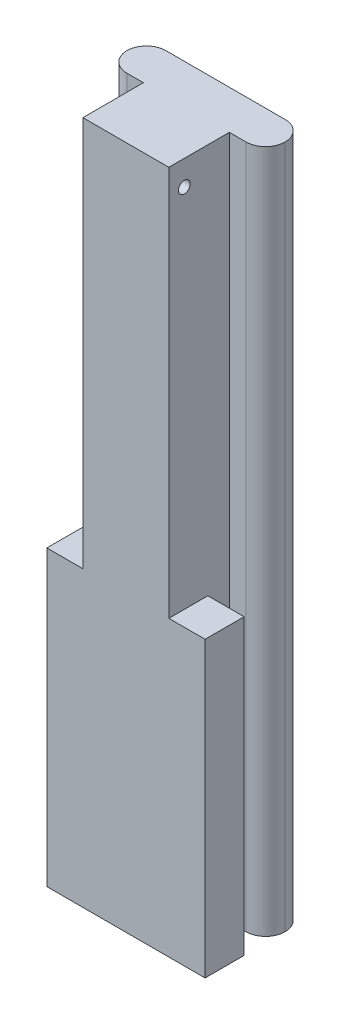
ISO-10303-21;
HEADER;
FILE_DESCRIPTION(('STEP AP214'),'2;1');
FILE_NAME('part.step','',(''),(''),'','','');
FILE_SCHEMA(('AUTOMOTIVE_DESIGN { 1 0 10303 214 1 1 1 1 }'));
ENDSEC;
DATA;
#1=APPLICATION_CONTEXT('core data for automotive mechanical design processes');
#2=APPLICATION_PROTOCOL_DEFINITION('international standard','automotive_design',2000,#1);
#3=PRODUCT_CONTEXT('',#1,'mechanical');
#4=PRODUCT('Part','Part','',(#3));
#5=PRODUCT_RELATED_PRODUCT_CATEGORY('part','',(#4));
#6=PRODUCT_DEFINITION_FORMATION('','',#4);
#7=PRODUCT_DEFINITION_CONTEXT('part definition',#1,'design');
#8=PRODUCT_DEFINITION('design','',#6,#7);
#9=PRODUCT_DEFINITION_SHAPE('','',#8);
#10=(LENGTH_UNIT() NAMED_UNIT(*) SI_UNIT(.MILLI.,.METRE.));
#11=(NAMED_UNIT(*) PLANE_ANGLE_UNIT() SI_UNIT($,.RADIAN.));
#12=(NAMED_UNIT(*) SI_UNIT($,.STERADIAN.) SOLID_ANGLE_UNIT());
#13=UNCERTAINTY_MEASURE_WITH_UNIT(LENGTH_MEASURE(1.E-05),#10,'distance_accuracy_value','');
#14=(GEOMETRIC_REPRESENTATION_CONTEXT(3) GLOBAL_UNCERTAINTY_ASSIGNED_CONTEXT((#13)) GLOBAL_UNIT_ASSIGNED_CONTEXT((#10,
#11,#12)) REPRESENTATION_CONTEXT('',''));
#15=CARTESIAN_POINT('',(0.,0.,0.));
#16=DIRECTION('',(0.,0.,1.));
#17=DIRECTION('',(1.,0.,0.));
#18=AXIS2_PLACEMENT_3D('',#15,#16,#17);
#19=CARTESIAN_POINT('',(205.763637230943,889.508,0.));
#20=DIRECTION('',(1.,0.,0.));
#21=DIRECTION('',(0.,0.,-1.));
#22=AXIS2_PLACEMENT_3D('',#19,#20,#21);
#23=PLANE('',#22);
#24=DIRECTION('',(0.,-1.,0.));
#25=VECTOR('',#24,1.);
#26=CARTESIAN_POINT('',(205.763637230943,889.508,78.6954653433618));
#27=LINE('',#26,#25);
#28=CARTESIAN_POINT('',(205.763637230943,381.508,78.6954653433618));
#29=VERTEX_POINT('',#28);
#30=CARTESIAN_POINT('',(205.763637230943,0.,78.6954653433618));
#31=VERTEX_POINT('',#30);
#32=EDGE_CURVE('E182',#29,#31,#27,.T.);
#33=ORIENTED_EDGE('',*,*,#32,.F.);
#34=DIRECTION('',(0.,0.,-1.));
#35=VECTOR('',#34,1.);
#36=CARTESIAN_POINT('',(205.763637230943,381.508,129.455055737705));
#37=LINE('',#36,#35);
#38=CARTESIAN_POINT('',(205.763637230943,381.508,129.455055737705));
#39=VERTEX_POINT('',#38);
#40=EDGE_CURVE('E171',#39,#29,#37,.T.);
#41=ORIENTED_EDGE('',*,*,#40,.F.);
#42=DIRECTION('',(0.,-1.,0.));
#43=VECTOR('',#42,1.);
#44=CARTESIAN_POINT('',(205.763637230943,889.508,129.455055737705));
#45=LINE('',#44,#43);
#46=CARTESIAN_POINT('',(205.763637230943,0.,129.455055737705));
#47=VERTEX_POINT('',#46);
#48=EDGE_CURVE('E197',#39,#47,#45,.T.);
#49=ORIENTED_EDGE('',*,*,#48,.T.);
#50=DIRECTION('',(0.,0.,1.));
#51=VECTOR('',#50,1.);
#52=CARTESIAN_POINT('',(205.763637230943,0.,0.));
#53=LINE('',#52,#51);
#54=EDGE_CURVE('E190',#31,#47,#53,.T.);
#55=ORIENTED_EDGE('',*,*,#54,.F.);
#56=EDGE_LOOP('',(#33,#41,#49,#55));
#57=FACE_BOUND('',#56,.T.);
#58=ADVANCED_FACE('F59',(#57),#23,.T.);
#59=CARTESIAN_POINT('',(171.535549032651,-441.706,78.6954653433618));
#60=DIRECTION('',(0.,0.,1.));
#61=DIRECTION('',(1.,0.,0.));
#62=AXIS2_PLACEMENT_3D('',#59,#60,#61);
#63=PLANE('',#62);
#64=DIRECTION('',(-1.,0.,0.));
#65=VECTOR('',#64,1.);
#66=CARTESIAN_POINT('',(205.763637230943,381.508,78.6954653433618));
#67=LINE('',#66,#65);
#68=CARTESIAN_POINT('',(158.621795518479,381.508,78.6954653433618));
#69=VERTEX_POINT('',#68);
#70=EDGE_CURVE('E75',#29,#69,#67,.T.);
#71=ORIENTED_EDGE('',*,*,#70,.F.);
#72=ORIENTED_EDGE('',*,*,#32,.T.);
#73=DIRECTION('',(1.,0.,0.));
#74=VECTOR('',#73,1.);
#75=CARTESIAN_POINT('',(0.,0.,78.6954653433618));
#76=LINE('',#75,#74);
#77=CARTESIAN_POINT('',(158.621795518479,0.,78.6954653433618));
#78=VERTEX_POINT('',#77);
#79=EDGE_CURVE('E240',#78,#31,#76,.T.);
#80=ORIENTED_EDGE('',*,*,#79,.F.);
#81=DIRECTION('',(0.,1.,0.));
#82=VECTOR('',#81,1.);
#83=CARTESIAN_POINT('',(158.621795518479,-354.838,78.6954653433618));
#84=LINE('',#83,#82);
#85=EDGE_CURVE('E185',#78,#69,#84,.T.);
#86=ORIENTED_EDGE('',*,*,#85,.T.);
#87=EDGE_LOOP('',(#71,#72,#80,#86));
#88=FACE_BOUND('',#87,.T.);
#89=ADVANCED_FACE('F181',(#88),#63,.F.);
#90=CARTESIAN_POINT('',(0.,889.508,0.));
#91=DIRECTION('',(0.,1.,0.));
#92=DIRECTION('',(0.,0.,1.));
#93=AXIS2_PLACEMENT_3D('',#90,#91,#92);
#94=PLANE('',#93);
#95=DIRECTION('',(1.,0.,0.));
#96=VECTOR('',#95,1.);
#97=CARTESIAN_POINT('',(0.,889.508,129.455055737705));
#98=LINE('',#97,#96);
#99=CARTESIAN_POINT('',(46.8494620224392,889.508,129.455055737705));
#100=VERTEX_POINT('',#99);
#101=CARTESIAN_POINT('',(158.621795518479,889.508,129.455055737705));
#102=VERTEX_POINT('',#101);
#103=EDGE_CURVE('E261',#100,#102,#98,.T.);
#104=ORIENTED_EDGE('',*,*,#103,.T.);
#105=DIRECTION('',(0.,0.,1.));
#106=VECTOR('',#105,1.);
#107=CARTESIAN_POINT('',(158.621795518479,889.508,50.7595903943368));
#108=LINE('',#107,#106);
#109=CARTESIAN_POINT('',(158.621795518479,889.508,50.7595903943368));
#110=VERTEX_POINT('',#109);
#111=EDGE_CURVE('E326',#110,#102,#108,.T.);
#112=ORIENTED_EDGE('',*,*,#111,.F.);
#113=DIRECTION('',(-1.,0.,0.));
#114=VECTOR('',#113,1.);
#115=CARTESIAN_POINT('',(205.763637230943,889.508,50.7595903943368));
#116=LINE('',#115,#114);
#117=CARTESIAN_POINT('',(180.363669375377,889.508,50.7595903943368));
#118=VERTEX_POINT('',#117);
#119=EDGE_CURVE('E297',#118,#110,#116,.T.);
#120=ORIENTED_EDGE('',*,*,#119,.F.);
#121=CARTESIAN_POINT('',(180.363669375377,889.508,25.3595903943368));
#122=DIRECTION('',(0.,1.,0.));
#123=DIRECTION('',(0.,0.,1.));
#124=AXIS2_PLACEMENT_3D('',#121,#122,#123);
#125=CIRCLE('',#124,25.4);
#126=CARTESIAN_POINT('',(205.763637230943,889.508,25.4));
#127=VERTEX_POINT('',#126);
#128=EDGE_CURVE('E220',#118,#127,#125,.T.);
#129=ORIENTED_EDGE('',*,*,#128,.T.);
#130=CARTESIAN_POINT('',(180.363637230943,889.508,25.4));
#131=DIRECTION('',(0.,1.,0.));
#132=DIRECTION('',(0.,0.,1.));
#133=AXIS2_PLACEMENT_3D('',#130,#131,#132);
#134=CIRCLE('',#133,25.4);
#135=CARTESIAN_POINT('',(180.363637230943,889.508,0.));
#136=VERTEX_POINT('',#135);
#137=EDGE_CURVE('E215',#127,#136,#134,.T.);
#138=ORIENTED_EDGE('',*,*,#137,.T.);
#139=DIRECTION('',(1.,0.,0.));
#140=VECTOR('',#139,1.);
#141=CARTESIAN_POINT('',(0.,889.508,0.));
#142=LINE('',#141,#140);
#143=CARTESIAN_POINT('',(25.4,889.508,0.));
#144=VERTEX_POINT('',#143);
#145=EDGE_CURVE('E257',#144,#136,#142,.T.);
#146=ORIENTED_EDGE('',*,*,#145,.F.);
#147=CARTESIAN_POINT('',(25.4,889.508,25.4));
#148=DIRECTION('',(0.,1.,0.));
#149=DIRECTION('',(0.,0.,1.));
#150=AXIS2_PLACEMENT_3D('',#147,#148,#149);
#151=CIRCLE('',#150,25.4);
#152=CARTESIAN_POINT('',(0.,889.508,25.4));
#153=VERTEX_POINT('',#152);
#154=EDGE_CURVE('E204',#144,#153,#151,.T.);
#155=ORIENTED_EDGE('',*,*,#154,.T.);
#156=CARTESIAN_POINT('',(25.3999678555657,889.508,25.3595903943368));
#157=DIRECTION('',(0.,1.,0.));
#158=DIRECTION('',(0.,0.,1.));
#159=AXIS2_PLACEMENT_3D('',#156,#157,#158);
#160=CIRCLE('',#159,25.4);
#161=CARTESIAN_POINT('',(25.3999678555657,889.508,50.7595903943368));
#162=VERTEX_POINT('',#161);
#163=EDGE_CURVE('E224',#153,#162,#160,.T.);
#164=ORIENTED_EDGE('',*,*,#163,.T.);
#165=DIRECTION('',(1.,0.,0.));
#166=VECTOR('',#165,1.);
#167=CARTESIAN_POINT('',(0.,889.508,50.7595903943368));
#168=LINE('',#167,#166);
#169=CARTESIAN_POINT('',(46.8494620224392,889.508,50.7595903943368));
#170=VERTEX_POINT('',#169);
#171=EDGE_CURVE('E229',#162,#170,#168,.T.);
#172=ORIENTED_EDGE('',*,*,#171,.T.);
#173=DIRECTION('',(0.,0.,1.));
#174=VECTOR('',#173,1.);
#175=CARTESIAN_POINT('',(46.8494620224392,889.508,50.7595903943368));
#176=LINE('',#175,#174);
#177=EDGE_CURVE('E302',#170,#100,#176,.T.);
#178=ORIENTED_EDGE('',*,*,#177,.T.);
#179=EDGE_LOOP('',(#104,#112,#120,#129,#138,#146,#155,#164,#172,#178));
#180=FACE_BOUND('',#179,.T.);
#181=ADVANCED_FACE('F228',(#180),#94,.T.);
#182=CARTESIAN_POINT('',(0.,889.508,129.455055737705));
#183=DIRECTION('',(0.,0.,-1.));
#184=DIRECTION('',(-1.,0.,0.));
#185=AXIS2_PLACEMENT_3D('',#182,#183,#184);
#186=PLANE('',#185);
#187=DIRECTION('',(1.,0.,0.));
#188=VECTOR('',#187,1.);
#189=CARTESIAN_POINT('',(158.621795518479,381.508,129.455055737705));
#190=LINE('',#189,#188);
#191=CARTESIAN_POINT('',(158.621795518479,381.508,129.455055737705));
#192=VERTEX_POINT('',#191);
#193=EDGE_CURVE('E174',#192,#39,#190,.T.);
#194=ORIENTED_EDGE('',*,*,#193,.F.);
#195=DIRECTION('',(0.,1.,0.));
#196=VECTOR('',#195,1.);
#197=CARTESIAN_POINT('',(158.621795518479,381.508,129.455055737705));
#198=LINE('',#197,#196);
#199=EDGE_CURVE('E340',#192,#102,#198,.T.);
#200=ORIENTED_EDGE('',*,*,#199,.T.);
#201=ORIENTED_EDGE('',*,*,#103,.F.);
#202=DIRECTION('',(0.,1.,0.));
#203=VECTOR('',#202,1.);
#204=CARTESIAN_POINT('',(46.8494620224392,381.508,129.455055737705));
#205=LINE('',#204,#203);
#206=CARTESIAN_POINT('',(46.8494620224392,381.508,129.455055737705));
#207=VERTEX_POINT('',#206);
#208=EDGE_CURVE('E329',#207,#100,#205,.T.);
#209=ORIENTED_EDGE('',*,*,#208,.F.);
#210=DIRECTION('',(-1.,0.,0.));
#211=VECTOR('',#210,1.);
#212=CARTESIAN_POINT('',(46.8494620224392,381.508,129.455055737705));
#213=LINE('',#212,#211);
#214=CARTESIAN_POINT('',(0.,381.508,129.455055737705));
#215=VERTEX_POINT('',#214);
#216=EDGE_CURVE('E282',#207,#215,#213,.T.);
#217=ORIENTED_EDGE('',*,*,#216,.T.);
#218=DIRECTION('',(0.,-1.,0.));
#219=VECTOR('',#218,1.);
#220=CARTESIAN_POINT('',(0.,889.508,129.455055737705));
#221=LINE('',#220,#219);
#222=CARTESIAN_POINT('',(0.,0.,129.455055737705));
#223=VERTEX_POINT('',#222);
#224=EDGE_CURVE('E192',#215,#223,#221,.T.);
#225=ORIENTED_EDGE('',*,*,#224,.T.);
#226=DIRECTION('',(1.,0.,0.));
#227=VECTOR('',#226,1.);
#228=CARTESIAN_POINT('',(0.,0.,129.455055737705));
#229=LINE('',#228,#227);
#230=EDGE_CURVE('E262',#223,#47,#229,.T.);
#231=ORIENTED_EDGE('',*,*,#230,.T.);
#232=ORIENTED_EDGE('',*,*,#48,.F.);
#233=EDGE_LOOP('',(#194,#200,#201,#209,#217,#225,#231,#232));
#234=FACE_BOUND('',#233,.T.);
#235=ADVANCED_FACE('F277',(#234),#186,.F.);
#236=CARTESIAN_POINT('',(0.,0.,0.));
#237=DIRECTION('',(0.,1.,0.));
#238=DIRECTION('',(0.,0.,1.));
#239=AXIS2_PLACEMENT_3D('',#236,#237,#238);
#240=PLANE('',#239);
#241=DIRECTION('',(0.,0.,1.));
#242=VECTOR('',#241,1.);
#243=CARTESIAN_POINT('',(158.621795518479,0.,0.));
#244=LINE('',#243,#242);
#245=CARTESIAN_POINT('',(158.621795518479,0.,50.7595903943368));
#246=VERTEX_POINT('',#245);
#247=EDGE_CURVE('E305',#246,#78,#244,.T.);
#248=ORIENTED_EDGE('',*,*,#247,.T.);
#249=ORIENTED_EDGE('',*,*,#79,.T.);
#250=ORIENTED_EDGE('',*,*,#54,.T.);
#251=ORIENTED_EDGE('',*,*,#230,.F.);
#252=DIRECTION('',(0.,0.,1.));
#253=VECTOR('',#252,1.);
#254=CARTESIAN_POINT('',(0.,0.,0.));
#255=LINE('',#254,#253);
#256=CARTESIAN_POINT('',(0.,0.,78.6954653433618));
#257=VERTEX_POINT('',#256);
#258=EDGE_CURVE('E266',#257,#223,#255,.T.);
#259=ORIENTED_EDGE('',*,*,#258,.F.);
#260=DIRECTION('',(-1.,0.,0.));
#261=VECTOR('',#260,1.);
#262=CARTESIAN_POINT('',(0.,0.,78.6954653433618));
#263=LINE('',#262,#261);
#264=CARTESIAN_POINT('',(46.8494620224392,0.,78.6954653433618));
#265=VERTEX_POINT('',#264);
#266=EDGE_CURVE('E288',#265,#257,#263,.T.);
#267=ORIENTED_EDGE('',*,*,#266,.F.);
#268=DIRECTION('',(0.,0.,1.));
#269=VECTOR('',#268,1.);
#270=CARTESIAN_POINT('',(46.8494620224392,0.,0.));
#271=LINE('',#270,#269);
#272=CARTESIAN_POINT('',(46.8494620224392,0.,50.7595903943368));
#273=VERTEX_POINT('',#272);
#274=EDGE_CURVE('E290',#273,#265,#271,.T.);
#275=ORIENTED_EDGE('',*,*,#274,.F.);
#276=DIRECTION('',(1.,0.,0.));
#277=VECTOR('',#276,1.);
#278=CARTESIAN_POINT('',(0.,0.,50.7595903943368));
#279=LINE('',#278,#277);
#280=CARTESIAN_POINT('',(25.3999678555657,0.,50.7595903943368));
#281=VERTEX_POINT('',#280);
#282=EDGE_CURVE('E250',#281,#273,#279,.T.);
#283=ORIENTED_EDGE('',*,*,#282,.F.);
#284=CARTESIAN_POINT('',(25.3999678555657,0.,25.3595903943368));
#285=DIRECTION('',(0.,1.,0.));
#286=DIRECTION('',(0.,0.,1.));
#287=AXIS2_PLACEMENT_3D('',#284,#285,#286);
#288=CIRCLE('',#287,25.4);
#289=CARTESIAN_POINT('',(0.,0.,25.4));
#290=VERTEX_POINT('',#289);
#291=EDGE_CURVE('E12',#281,#290,#288,.F.);
#292=ORIENTED_EDGE('',*,*,#291,.T.);
#293=CARTESIAN_POINT('',(25.4,0.,25.4));
#294=DIRECTION('',(0.,1.,0.));
#295=DIRECTION('',(0.,0.,1.));
#296=AXIS2_PLACEMENT_3D('',#293,#294,#295);
#297=CIRCLE('',#296,25.4);
#298=CARTESIAN_POINT('',(25.4,0.,0.));
#299=VERTEX_POINT('',#298);
#300=EDGE_CURVE('E195',#290,#299,#297,.F.);
#301=ORIENTED_EDGE('',*,*,#300,.T.);
#302=DIRECTION('',(1.,0.,0.));
#303=VECTOR('',#302,1.);
#304=CARTESIAN_POINT('',(0.,0.,0.));
#305=LINE('',#304,#303);
#306=CARTESIAN_POINT('',(180.363637230943,0.,0.));
#307=VERTEX_POINT('',#306);
#308=EDGE_CURVE('E259',#299,#307,#305,.T.);
#309=ORIENTED_EDGE('',*,*,#308,.T.);
#310=CARTESIAN_POINT('',(180.363637230943,0.,25.4));
#311=DIRECTION('',(0.,1.,0.));
#312=DIRECTION('',(0.,0.,1.));
#313=AXIS2_PLACEMENT_3D('',#310,#311,#312);
#314=CIRCLE('',#313,25.4);
#315=CARTESIAN_POINT('',(205.763637230943,0.,25.4));
#316=VERTEX_POINT('',#315);
#317=EDGE_CURVE('E210',#307,#316,#314,.F.);
#318=ORIENTED_EDGE('',*,*,#317,.T.);
#319=CARTESIAN_POINT('',(180.363669375377,0.,25.3595903943368));
#320=DIRECTION('',(0.,1.,0.));
#321=DIRECTION('',(0.,0.,1.));
#322=AXIS2_PLACEMENT_3D('',#319,#320,#321);
#323=CIRCLE('',#322,25.4);
#324=CARTESIAN_POINT('',(180.363669375377,0.,50.7595903943368));
#325=VERTEX_POINT('',#324);
#326=EDGE_CURVE('E222',#316,#325,#323,.F.);
#327=ORIENTED_EDGE('',*,*,#326,.T.);
#328=DIRECTION('',(-1.,0.,0.));
#329=VECTOR('',#328,1.);
#330=CARTESIAN_POINT('',(0.,0.,50.7595903943368));
#331=LINE('',#330,#329);
#332=EDGE_CURVE('E310',#325,#246,#331,.T.);
#333=ORIENTED_EDGE('',*,*,#332,.T.);
#334=EDGE_LOOP('',(#248,#249,#250,#251,#259,#267,#275,#283,#292,#301,#309,#318,#327,#333));
#335=FACE_BOUND('',#334,.T.);
#336=ADVANCED_FACE('F246',(#335),#240,.F.);
#337=CARTESIAN_POINT('',(0.,889.508,0.));
#338=DIRECTION('',(1.,0.,0.));
#339=DIRECTION('',(0.,0.,-1.));
#340=AXIS2_PLACEMENT_3D('',#337,#338,#339);
#341=PLANE('',#340);
#342=ORIENTED_EDGE('',*,*,#224,.F.);
#343=DIRECTION('',(0.,0.,-1.));
#344=VECTOR('',#343,1.);
#345=CARTESIAN_POINT('',(0.,381.508,129.455055737705));
#346=LINE('',#345,#344);
#347=CARTESIAN_POINT('',(0.,381.508,78.6954653433618));
#348=VERTEX_POINT('',#347);
#349=EDGE_CURVE('E338',#215,#348,#346,.T.);
#350=ORIENTED_EDGE('',*,*,#349,.T.);
#351=DIRECTION('',(0.,1.,0.));
#352=VECTOR('',#351,1.);
#353=CARTESIAN_POINT('',(0.,-262.128,78.6954653433618));
#354=LINE('',#353,#352);
#355=EDGE_CURVE('E239',#257,#348,#354,.T.);
#356=ORIENTED_EDGE('',*,*,#355,.F.);
#357=ORIENTED_EDGE('',*,*,#258,.T.);
#358=EDGE_LOOP('',(#342,#350,#356,#357));
#359=FACE_BOUND('',#358,.T.);
#360=ADVANCED_FACE('F286',(#359),#341,.F.);
#361=CARTESIAN_POINT('',(0.,889.508,0.));
#362=DIRECTION('',(0.,0.,-1.));
#363=DIRECTION('',(-1.,0.,0.));
#364=AXIS2_PLACEMENT_3D('',#361,#362,#363);
#365=PLANE('',#364);
#366=ORIENTED_EDGE('',*,*,#145,.T.);
#367=DIRECTION('',(0.,-1.,0.));
#368=VECTOR('',#367,1.);
#369=CARTESIAN_POINT('',(180.363637230943,889.508,0.));
#370=LINE('',#369,#368);
#371=EDGE_CURVE('E207',#136,#307,#370,.T.);
#372=ORIENTED_EDGE('',*,*,#371,.T.);
#373=ORIENTED_EDGE('',*,*,#308,.F.);
#374=DIRECTION('',(0.,-1.,0.));
#375=VECTOR('',#374,1.);
#376=CARTESIAN_POINT('',(25.4,889.508,0.));
#377=LINE('',#376,#375);
#378=EDGE_CURVE('E202',#299,#144,#377,.F.);
#379=ORIENTED_EDGE('',*,*,#378,.T.);
#380=EDGE_LOOP('',(#366,#372,#373,#379));
#381=FACE_BOUND('',#380,.T.);
#382=ADVANCED_FACE('F256',(#381),#365,.T.);
#383=CARTESIAN_POINT('',(0.,-262.128,50.7595903943368));
#384=DIRECTION('',(0.,0.,1.));
#385=DIRECTION('',(1.,0.,0.));
#386=AXIS2_PLACEMENT_3D('',#383,#384,#385);
#387=PLANE('',#386);
#388=ORIENTED_EDGE('',*,*,#171,.F.);
#389=DIRECTION('',(0.,1.,0.));
#390=VECTOR('',#389,1.);
#391=CARTESIAN_POINT('',(25.3999678555657,0.,50.7595903943368));
#392=LINE('',#391,#390);
#393=EDGE_CURVE('E68',#162,#281,#392,.F.);
#394=ORIENTED_EDGE('',*,*,#393,.T.);
#395=ORIENTED_EDGE('',*,*,#282,.T.);
#396=DIRECTION('',(0.,1.,0.));
#397=VECTOR('',#396,1.);
#398=CARTESIAN_POINT('',(46.8494620224392,-174.244,50.7595903943368));
#399=LINE('',#398,#397);
#400=EDGE_CURVE('E237',#273,#170,#399,.T.);
#401=ORIENTED_EDGE('',*,*,#400,.T.);
#402=EDGE_LOOP('',(#388,#394,#395,#401));
#403=FACE_BOUND('',#402,.T.);
#404=ADVANCED_FACE('F235',(#403),#387,.T.);
#405=CARTESIAN_POINT('',(34.2280881982923,-262.128,78.6954653433618));
#406=DIRECTION('',(0.,0.,-1.));
#407=DIRECTION('',(-1.,0.,0.));
#408=AXIS2_PLACEMENT_3D('',#405,#406,#407);
#409=PLANE('',#408);
#410=DIRECTION('',(1.,0.,0.));
#411=VECTOR('',#410,1.);
#412=CARTESIAN_POINT('',(0.,381.508,78.6954653433618));
#413=LINE('',#412,#411);
#414=CARTESIAN_POINT('',(46.8494620224392,381.508,78.6954653433618));
#415=VERTEX_POINT('',#414);
#416=EDGE_CURVE('E301',#348,#415,#413,.T.);
#417=ORIENTED_EDGE('',*,*,#416,.T.);
#418=DIRECTION('',(0.,1.,0.));
#419=VECTOR('',#418,1.);
#420=CARTESIAN_POINT('',(46.8494620224392,-174.244,78.6954653433618));
#421=LINE('',#420,#419);
#422=EDGE_CURVE('E296',#265,#415,#421,.T.);
#423=ORIENTED_EDGE('',*,*,#422,.F.);
#424=ORIENTED_EDGE('',*,*,#266,.T.);
#425=ORIENTED_EDGE('',*,*,#355,.T.);
#426=EDGE_LOOP('',(#417,#423,#424,#425));
#427=FACE_BOUND('',#426,.T.);
#428=ADVANCED_FACE('F300',(#427),#409,.T.);
#429=CARTESIAN_POINT('',(205.763637230943,-441.706,50.7595903943368));
#430=DIRECTION('',(0.,0.,-1.));
#431=DIRECTION('',(-1.,0.,0.));
#432=AXIS2_PLACEMENT_3D('',#429,#430,#431);
#433=PLANE('',#432);
#434=ORIENTED_EDGE('',*,*,#332,.F.);
#435=DIRECTION('',(0.,-1.,0.));
#436=VECTOR('',#435,1.);
#437=CARTESIAN_POINT('',(180.363669375377,-441.706,50.7595903943368));
#438=LINE('',#437,#436);
#439=EDGE_CURVE('E217',#325,#118,#438,.F.);
#440=ORIENTED_EDGE('',*,*,#439,.T.);
#441=ORIENTED_EDGE('',*,*,#119,.T.);
#442=DIRECTION('',(0.,1.,0.));
#443=VECTOR('',#442,1.);
#444=CARTESIAN_POINT('',(158.621795518479,-354.838,50.7595903943368));
#445=LINE('',#444,#443);
#446=EDGE_CURVE('E322',#246,#110,#445,.T.);
#447=ORIENTED_EDGE('',*,*,#446,.F.);
#448=EDGE_LOOP('',(#434,#440,#441,#447));
#449=FACE_BOUND('',#448,.T.);
#450=ADVANCED_FACE('F324',(#449),#433,.F.);
#451=CARTESIAN_POINT('',(25.4,889.508,25.4));
#452=DIRECTION('',(0.,1.,0.));
#453=DIRECTION('',(0.,0.,1.));
#454=AXIS2_PLACEMENT_3D('',#451,#452,#453);
#455=CYLINDRICAL_SURFACE('',#454,25.4);
#456=ORIENTED_EDGE('',*,*,#154,.F.);
#457=ORIENTED_EDGE('',*,*,#378,.F.);
#458=ORIENTED_EDGE('',*,*,#300,.F.);
#459=DIRECTION('',(0.,-1.,0.));
#460=VECTOR('',#459,1.);
#461=CARTESIAN_POINT('',(0.,0.,25.4));
#462=LINE('',#461,#460);
#463=EDGE_CURVE('E191',#153,#290,#462,.T.);
#464=ORIENTED_EDGE('',*,*,#463,.F.);
#465=EDGE_LOOP('',(#456,#457,#458,#464));
#466=FACE_BOUND('',#465,.T.);
#467=ADVANCED_FACE('F253',(#466),#455,.T.);
#468=CARTESIAN_POINT('',(180.363637230943,889.508,25.4));
#469=DIRECTION('',(0.,-1.,0.));
#470=DIRECTION('',(0.,0.,-1.));
#471=AXIS2_PLACEMENT_3D('',#468,#469,#470);
#472=CYLINDRICAL_SURFACE('',#471,25.4);
#473=ORIENTED_EDGE('',*,*,#137,.F.);
#474=DIRECTION('',(0.,-1.,0.));
#475=VECTOR('',#474,1.);
#476=CARTESIAN_POINT('',(205.763637230943,889.508,25.4));
#477=LINE('',#476,#475);
#478=EDGE_CURVE('E212',#316,#127,#477,.F.);
#479=ORIENTED_EDGE('',*,*,#478,.F.);
#480=ORIENTED_EDGE('',*,*,#317,.F.);
#481=ORIENTED_EDGE('',*,*,#371,.F.);
#482=EDGE_LOOP('',(#473,#479,#480,#481));
#483=FACE_BOUND('',#482,.T.);
#484=ADVANCED_FACE('F372',(#483),#472,.T.);
#485=CARTESIAN_POINT('',(180.363669375377,889.508,25.3595903943368));
#486=DIRECTION('',(0.,-1.,0.));
#487=DIRECTION('',(0.,0.,-1.));
#488=AXIS2_PLACEMENT_3D('',#485,#486,#487);
#489=CYLINDRICAL_SURFACE('',#488,25.4);
#490=ORIENTED_EDGE('',*,*,#326,.F.);
#491=ORIENTED_EDGE('',*,*,#478,.T.);
#492=ORIENTED_EDGE('',*,*,#128,.F.);
#493=ORIENTED_EDGE('',*,*,#439,.F.);
#494=EDGE_LOOP('',(#490,#491,#492,#493));
#495=FACE_BOUND('',#494,.T.);
#496=ADVANCED_FACE('F374',(#495),#489,.T.);
#497=CARTESIAN_POINT('',(25.3999678555657,889.508,25.3595903943368));
#498=DIRECTION('',(0.,-1.,0.));
#499=DIRECTION('',(0.,0.,-1.));
#500=AXIS2_PLACEMENT_3D('',#497,#498,#499);
#501=CYLINDRICAL_SURFACE('',#500,25.4);
#502=ORIENTED_EDGE('',*,*,#291,.F.);
#503=ORIENTED_EDGE('',*,*,#393,.F.);
#504=ORIENTED_EDGE('',*,*,#163,.F.);
#505=ORIENTED_EDGE('',*,*,#463,.T.);
#506=EDGE_LOOP('',(#502,#503,#504,#505));
#507=FACE_BOUND('',#506,.T.);
#508=ADVANCED_FACE('F61',(#507),#501,.T.);
#509=CARTESIAN_POINT('',(46.8494620224392,-174.244,50.7595903943368));
#510=DIRECTION('',(-1.,0.,0.));
#511=DIRECTION('',(0.,0.,1.));
#512=AXIS2_PLACEMENT_3D('',#509,#510,#511);
#513=PLANE('',#512);
#514=CARTESIAN_POINT('',(46.8494620224392,857.026947913489,109.367874663275));
#515=DIRECTION('',(-1.,0.,0.));
#516=DIRECTION('',(0.,0.,1.));
#517=AXIS2_PLACEMENT_3D('',#514,#515,#516);
#518=CIRCLE('',#517,7.65889227685579);
#519=CARTESIAN_POINT('',(46.8494620224392,857.026947913489,117.02676694013));
#520=VERTEX_POINT('',#519);
#521=EDGE_CURVE('E345',#520,#520,#518,.T.);
#522=ORIENTED_EDGE('',*,*,#521,.F.);
#523=EDGE_LOOP('',(#522));
#524=FACE_BOUND('',#523,.T.);
#525=ORIENTED_EDGE('',*,*,#274,.T.);
#526=ORIENTED_EDGE('',*,*,#422,.T.);
#527=DIRECTION('',(0.,0.,1.));
#528=VECTOR('',#527,1.);
#529=CARTESIAN_POINT('',(46.8494620224392,381.508,78.6954653433618));
#530=LINE('',#529,#528);
#531=EDGE_CURVE('E335',#415,#207,#530,.T.);
#532=ORIENTED_EDGE('',*,*,#531,.T.);
#533=ORIENTED_EDGE('',*,*,#208,.T.);
#534=ORIENTED_EDGE('',*,*,#177,.F.);
#535=ORIENTED_EDGE('',*,*,#400,.F.);
#536=EDGE_LOOP('',(#525,#526,#532,#533,#534,#535));
#537=FACE_BOUND('',#536,.T.);
#538=ADVANCED_FACE('F295',(#524,#537),#513,.T.);
#539=CARTESIAN_POINT('',(158.621795518479,-354.838,50.7595903943368));
#540=DIRECTION('',(-1.,0.,0.));
#541=DIRECTION('',(0.,0.,1.));
#542=AXIS2_PLACEMENT_3D('',#539,#540,#541);
#543=PLANE('',#542);
#544=CARTESIAN_POINT('',(158.621795518479,857.026947913489,109.367874663275));
#545=DIRECTION('',(-1.,0.,0.));
#546=DIRECTION('',(0.,0.,1.));
#547=AXIS2_PLACEMENT_3D('',#544,#545,#546);
#548=CIRCLE('',#547,7.65889227685579);
#549=CARTESIAN_POINT('',(158.621795518479,857.026947913489,117.02676694013));
#550=VERTEX_POINT('',#549);
#551=EDGE_CURVE('E63',#550,#550,#548,.T.);
#552=ORIENTED_EDGE('',*,*,#551,.T.);
#553=EDGE_LOOP('',(#552));
#554=FACE_BOUND('',#553,.T.);
#555=ORIENTED_EDGE('',*,*,#446,.T.);
#556=ORIENTED_EDGE('',*,*,#111,.T.);
#557=ORIENTED_EDGE('',*,*,#199,.F.);
#558=DIRECTION('',(0.,0.,1.));
#559=VECTOR('',#558,1.);
#560=CARTESIAN_POINT('',(158.621795518479,381.508,78.6954653433618));
#561=LINE('',#560,#559);
#562=EDGE_CURVE('E186',#69,#192,#561,.T.);
#563=ORIENTED_EDGE('',*,*,#562,.F.);
#564=ORIENTED_EDGE('',*,*,#85,.F.);
#565=ORIENTED_EDGE('',*,*,#247,.F.);
#566=EDGE_LOOP('',(#555,#556,#557,#563,#564,#565));
#567=FACE_BOUND('',#566,.T.);
#568=ADVANCED_FACE('F321',(#554,#567),#543,.F.);
#569=CARTESIAN_POINT('',(0.,381.508,0.));
#570=DIRECTION('',(0.,-1.,0.));
#571=DIRECTION('',(0.,0.,-1.));
#572=AXIS2_PLACEMENT_3D('',#569,#570,#571);
#573=PLANE('',#572);
#574=ORIENTED_EDGE('',*,*,#349,.F.);
#575=ORIENTED_EDGE('',*,*,#216,.F.);
#576=ORIENTED_EDGE('',*,*,#531,.F.);
#577=ORIENTED_EDGE('',*,*,#416,.F.);
#578=EDGE_LOOP('',(#574,#575,#576,#577));
#579=FACE_BOUND('',#578,.T.);
#580=ADVANCED_FACE('F359',(#579),#573,.F.);
#581=CARTESIAN_POINT('',(0.,381.508,0.));
#582=DIRECTION('',(0.,1.,0.));
#583=DIRECTION('',(0.,0.,1.));
#584=AXIS2_PLACEMENT_3D('',#581,#582,#583);
#585=PLANE('',#584);
#586=ORIENTED_EDGE('',*,*,#40,.T.);
#587=ORIENTED_EDGE('',*,*,#70,.T.);
#588=ORIENTED_EDGE('',*,*,#562,.T.);
#589=ORIENTED_EDGE('',*,*,#193,.T.);
#590=EDGE_LOOP('',(#586,#587,#588,#589));
#591=FACE_BOUND('',#590,.T.);
#592=ADVANCED_FACE('F172',(#591),#585,.T.);
#593=CARTESIAN_POINT('',(310.501462022439,857.026947913489,109.367874663275));
#594=DIRECTION('',(-1.,0.,0.));
#595=DIRECTION('',(0.,0.,1.));
#596=AXIS2_PLACEMENT_3D('',#593,#594,#595);
#597=CYLINDRICAL_SURFACE('',#596,7.65889227685579);
#598=ORIENTED_EDGE('',*,*,#521,.T.);
#599=EDGE_LOOP('',(#598));
#600=FACE_BOUND('',#599,.T.);
#601=ORIENTED_EDGE('',*,*,#551,.F.);
#602=EDGE_LOOP('',(#601));
#603=FACE_BOUND('',#602,.T.);
#604=ADVANCED_FACE('F353',(#600,#603),#597,.F.);
#605=CLOSED_SHELL('',(#58,#89,#181,#235,#336,#360,#382,#404,#428,#450,#467,#484,#496,#508,#538,
#568,#580,#592,#604));
#606=MANIFOLD_SOLID_BREP('B2',#605);
#607=ADVANCED_BREP_SHAPE_REPRESENTATION('',(#18,#606),#14);
#608=SHAPE_DEFINITION_REPRESENTATION(#9,#607);
ENDSEC;
END-ISO-10303-21;
